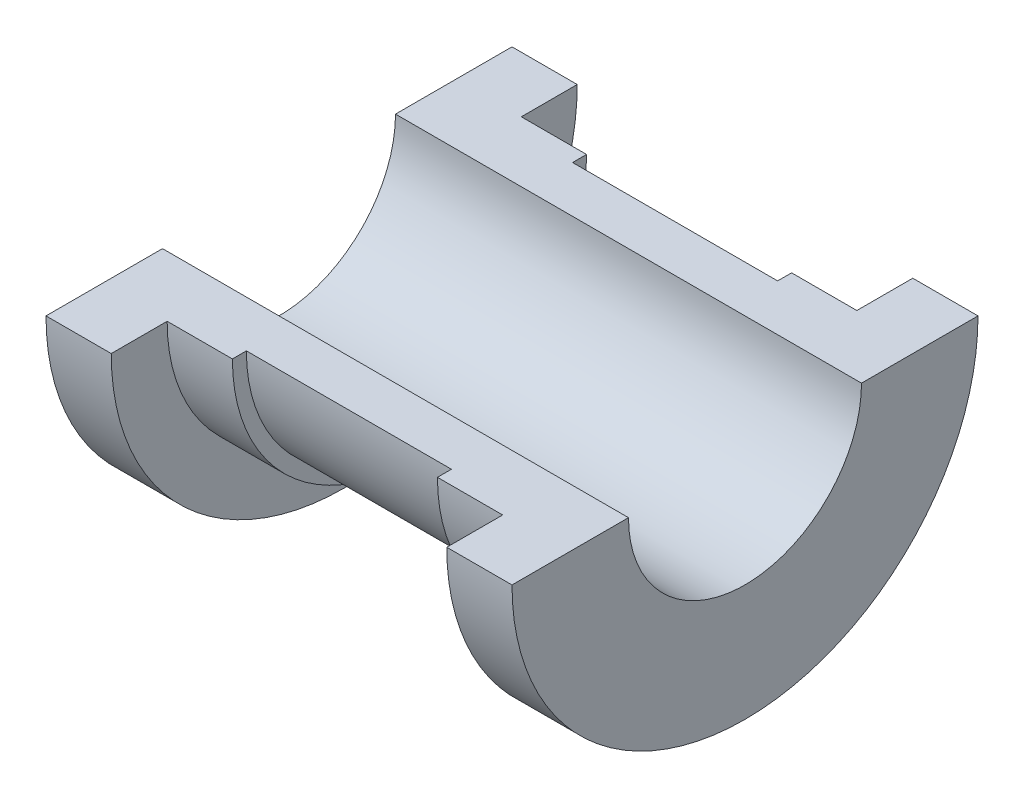
ISO-10303-21;
HEADER;
FILE_DESCRIPTION(('STEP AP214'),'2;1');
FILE_NAME('part.step','',(''),(''),'','','');
FILE_SCHEMA(('AUTOMOTIVE_DESIGN { 1 0 10303 214 1 1 1 1 }'));
ENDSEC;
DATA;
#1=APPLICATION_CONTEXT('core data for automotive mechanical design processes');
#2=APPLICATION_PROTOCOL_DEFINITION('international standard','automotive_design',2000,#1);
#3=PRODUCT_CONTEXT('',#1,'mechanical');
#4=PRODUCT('Part','Part','',(#3));
#5=PRODUCT_RELATED_PRODUCT_CATEGORY('part','',(#4));
#6=PRODUCT_DEFINITION_FORMATION('','',#4);
#7=PRODUCT_DEFINITION_CONTEXT('part definition',#1,'design');
#8=PRODUCT_DEFINITION('design','',#6,#7);
#9=PRODUCT_DEFINITION_SHAPE('','',#8);
#10=(LENGTH_UNIT() NAMED_UNIT(*) SI_UNIT(.MILLI.,.METRE.));
#11=(NAMED_UNIT(*) PLANE_ANGLE_UNIT() SI_UNIT($,.RADIAN.));
#12=(NAMED_UNIT(*) SI_UNIT($,.STERADIAN.) SOLID_ANGLE_UNIT());
#13=UNCERTAINTY_MEASURE_WITH_UNIT(LENGTH_MEASURE(1.E-05),#10,'distance_accuracy_value','');
#14=(GEOMETRIC_REPRESENTATION_CONTEXT(3) GLOBAL_UNCERTAINTY_ASSIGNED_CONTEXT((#13)) GLOBAL_UNIT_ASSIGNED_CONTEXT((#10,
#11,#12)) REPRESENTATION_CONTEXT('',''));
#15=CARTESIAN_POINT('',(0.,0.,0.));
#16=DIRECTION('',(0.,0.,1.));
#17=DIRECTION('',(1.,0.,0.));
#18=AXIS2_PLACEMENT_3D('',#15,#16,#17);
#19=CARTESIAN_POINT('',(-25.,0.,0.));
#20=DIRECTION('',(-1.,0.,0.));
#21=DIRECTION('',(0.,0.,1.));
#22=AXIS2_PLACEMENT_3D('',#19,#20,#21);
#23=CYLINDRICAL_SURFACE('',#22,17.5);
#24=DIRECTION('',(-1.,0.,0.));
#25=VECTOR('',#24,1.);
#26=CARTESIAN_POINT('',(-25.,0.,-17.5));
#27=LINE('',#26,#25);
#28=CARTESIAN_POINT('',(11.,0.,-17.5));
#29=VERTEX_POINT('',#28);
#30=CARTESIAN_POINT('',(-11.,0.,-17.5));
#31=VERTEX_POINT('',#30);
#32=EDGE_CURVE('E231',#29,#31,#27,.T.);
#33=ORIENTED_EDGE('',*,*,#32,.F.);
#34=CARTESIAN_POINT('',(11.,0.,0.));
#35=DIRECTION('',(-1.,0.,0.));
#36=DIRECTION('',(0.,0.,1.));
#37=AXIS2_PLACEMENT_3D('',#34,#35,#36);
#38=CIRCLE('',#37,17.5);
#39=CARTESIAN_POINT('',(11.,0.,17.5));
#40=VERTEX_POINT('',#39);
#41=EDGE_CURVE('E178',#29,#40,#38,.T.);
#42=ORIENTED_EDGE('',*,*,#41,.T.);
#43=DIRECTION('',(-1.,0.,0.));
#44=VECTOR('',#43,1.);
#45=CARTESIAN_POINT('',(-25.,0.,17.5));
#46=LINE('',#45,#44);
#47=CARTESIAN_POINT('',(-11.,0.,17.5));
#48=VERTEX_POINT('',#47);
#49=EDGE_CURVE('E209',#48,#40,#46,.F.);
#50=ORIENTED_EDGE('',*,*,#49,.F.);
#51=CARTESIAN_POINT('',(-11.,0.,0.));
#52=DIRECTION('',(-1.,0.,0.));
#53=DIRECTION('',(0.,0.,1.));
#54=AXIS2_PLACEMENT_3D('',#51,#52,#53);
#55=CIRCLE('',#54,17.5);
#56=EDGE_CURVE('E182',#31,#48,#55,.T.);
#57=ORIENTED_EDGE('',*,*,#56,.F.);
#58=EDGE_LOOP('',(#33,#42,#50,#57));
#59=FACE_BOUND('',#58,.T.);
#60=CARTESIAN_POINT('',(0.,-17.2409396495667,-3.));
#61=CARTESIAN_POINT('',(0.167177539672033,-17.2409427238107,-2.99999334322019));
#62=CARTESIAN_POINT('',(0.334444610125394,-17.2433975799678,-2.9859784908008));
#63=CARTESIAN_POINT('',(0.664280447231107,-17.2529421043199,-2.93031666162569));
#64=CARTESIAN_POINT('',(0.826844817679551,-17.2600359717149,-2.88864464929492));
#65=CARTESIAN_POINT('',(1.14245429646313,-17.2780319968807,-2.77897046037278));
#66=CARTESIAN_POINT('',(1.29550742912675,-17.2889308916418,-2.71099083852852));
#67=CARTESIAN_POINT('',(1.58802070935212,-17.313305084328,-2.55068812102202));
#68=CARTESIAN_POINT('',(1.72748228127175,-17.3267801118422,-2.45836757998599));
#69=CARTESIAN_POINT('',(1.99032230449614,-17.3549451758276,-2.25097753821767));
#70=CARTESIAN_POINT('',(2.11353855159674,-17.3696453757954,-2.13570381628918));
#71=CARTESIAN_POINT('',(2.33898043820508,-17.3985142730382,-1.8861209742386));
#72=CARTESIAN_POINT('',(2.44120480521907,-17.4126829380499,-1.75181070098527));
#73=CARTESIAN_POINT('',(2.62237281253491,-17.4390002009036,-1.46691308220606));
#74=CARTESIAN_POINT('',(2.70116504795438,-17.4511354492007,-1.31622811896212));
#75=CARTESIAN_POINT('',(2.83225850244604,-17.4719053147098,-1.00351837852194));
#76=CARTESIAN_POINT('',(2.88456154295918,-17.4805401726063,-0.841494381888663));
#77=CARTESIAN_POINT('',(2.9606945792627,-17.4932645851018,-0.51238286841017));
#78=CARTESIAN_POINT('',(2.98479732872912,-17.4973976536599,-0.345360157307003));
#79=CARTESIAN_POINT('',(3.00469411724344,-17.5008024112351,-0.00959366953916439));
#80=CARTESIAN_POINT('',(3.0004901869268,-17.500074448968,0.159149982803278));
#81=CARTESIAN_POINT('',(2.96410488928973,-17.4938735157789,0.49170222359127));
#82=CARTESIAN_POINT('',(2.93221709006925,-17.4884503360207,0.655543993481229));
#83=CARTESIAN_POINT('',(2.84183194212004,-17.4735238964266,0.975516328537307));
#84=CARTESIAN_POINT('',(2.78333374661758,-17.4640205067542,1.13164664814084));
#85=CARTESIAN_POINT('',(2.64109924921116,-17.4419170029363,1.43263245757703));
#86=CARTESIAN_POINT('',(2.55724277407832,-17.4293021974191,1.57743003521028));
#87=CARTESIAN_POINT('',(2.36676024360018,-17.402375995437,1.85100900942164));
#88=CARTESIAN_POINT('',(2.26013224138606,-17.3880644539551,1.9797890350765));
#89=CARTESIAN_POINT('',(2.02550744879178,-17.3591182543925,2.21941290689029));
#90=CARTESIAN_POINT('',(1.89725401375731,-17.344481806616,2.33000539360505));
#91=CARTESIAN_POINT('',(1.6238815720677,-17.3167125731742,2.52814283244136));
#92=CARTESIAN_POINT('',(1.47876239186054,-17.3035798029848,2.61568754736626));
#93=CARTESIAN_POINT('',(1.17547725811367,-17.280303555666,2.76529859974534));
#94=CARTESIAN_POINT('',(1.01729539918555,-17.2701637936693,2.82733330960205));
#95=CARTESIAN_POINT('',(0.692543264353517,-17.2540820099746,2.92387975772742));
#96=CARTESIAN_POINT('',(0.525973774257824,-17.2481395958225,2.95839406920572));
#97=CARTESIAN_POINT('',(0.191427521745489,-17.2412016562193,2.99856320128749));
#98=CARTESIAN_POINT('',(0.0234950915230579,-17.2401446099915,3.00457695031049));
#99=CARTESIAN_POINT('',(-0.310976212829604,-17.2429330582015,2.98853197620301));
#100=CARTESIAN_POINT('',(-0.477515143767139,-17.2467783518012,2.96647440309381));
#101=CARTESIAN_POINT('',(-0.803323189710403,-17.258881270067,2.89521941159178));
#102=CARTESIAN_POINT('',(-0.962633731338456,-17.2671089866899,2.84620588243531));
#103=CARTESIAN_POINT('',(-1.27078018367313,-17.2870244527025,2.72262364312904));
#104=CARTESIAN_POINT('',(-1.41961543459914,-17.2987124197933,2.64805332503161));
#105=CARTESIAN_POINT('',(-1.70418032548544,-17.324373772823,2.47463177769395));
#106=CARTESIAN_POINT('',(-1.83976828473403,-17.3383682986708,2.37555125161585));
#107=CARTESIAN_POINT('',(-2.09252245195547,-17.3670046347296,2.15623532353636));
#108=CARTESIAN_POINT('',(-2.20968728480254,-17.381646493154,2.03599834380818));
#109=CARTESIAN_POINT('',(-2.42358659555313,-17.4101230054923,1.77618954233157));
#110=CARTESIAN_POINT('',(-2.52008125794637,-17.4239469640735,1.63641893008565));
#111=CARTESIAN_POINT('',(-2.68821855131539,-17.4490567338254,1.34244211015567));
#112=CARTESIAN_POINT('',(-2.75986202160963,-17.4603426307116,1.18823639022304));
#113=CARTESIAN_POINT('',(-2.87589313081232,-17.4790582835881,0.870468175561603));
#114=CARTESIAN_POINT('',(-2.92040456596352,-17.4865055299022,0.706951958816392));
#115=CARTESIAN_POINT('',(-2.9813060002943,-17.4967788729714,0.374626699017907));
#116=CARTESIAN_POINT('',(-2.99769845343329,-17.4996053729806,0.205818119141562));
#117=CARTESIAN_POINT('',(-3.00182273517432,-17.5003125469087,-0.129988654143555));
#118=CARTESIAN_POINT('',(-2.98991884992763,-17.4982560843078,-0.296982352593287));
#119=CARTESIAN_POINT('',(-2.93857846355612,-17.4895572282875,-0.626554113404314));
#120=CARTESIAN_POINT('',(-2.89914213888004,-17.4829148642581,-0.789132204057234));
#121=CARTESIAN_POINT('',(-2.79399920026691,-17.4657883771442,-1.10510688506267));
#122=CARTESIAN_POINT('',(-2.72832528304086,-17.4553090369673,-1.25851463077402));
#123=CARTESIAN_POINT('',(-2.57261258994026,-17.4316504514312,-1.55218949226269));
#124=CARTESIAN_POINT('',(-2.48257255174676,-17.4184710662012,-1.69245592673013));
#125=CARTESIAN_POINT('',(-2.27940021091573,-17.390671178074,-1.95769741805989));
#126=CARTESIAN_POINT('',(-2.16600189541688,-17.3760351790944,-2.08246711008153));
#127=CARTESIAN_POINT('',(-1.91988909363515,-17.3470767953719,-2.31133475460775));
#128=CARTESIAN_POINT('',(-1.78717008821325,-17.3327544849054,-2.41542785732055));
#129=CARTESIAN_POINT('',(-1.50499349328928,-17.305928230343,-2.60071215805767));
#130=CARTESIAN_POINT('',(-1.35541731797514,-17.2934388002337,-2.68172488708189));
#131=CARTESIAN_POINT('',(-1.04462310549563,-17.2718645235111,-2.81734831227997));
#132=CARTESIAN_POINT('',(-0.883416741217313,-17.2627763183619,-2.87198506892152));
#133=CARTESIAN_POINT('',(-0.601345156446047,-17.2510229398289,-2.94160477458961));
#134=CARTESIAN_POINT('',(-0.482176321494034,-17.2472630378549,-2.96346733737592));
#135=CARTESIAN_POINT('',(-0.242020609403687,-17.2422203045731,-2.99266721494119));
#136=CARTESIAN_POINT('',(-0.121033768571193,-17.2409374238649,-3.00000481939828));
#137=CARTESIAN_POINT('',(0.,-17.2409396495667,-3.));
#138=B_SPLINE_CURVE_WITH_KNOTS('',3,(#60,#61,#62,#63,#64,#65,#66,#67,#68,#69,#70,#71,#72,#73,
#74,#75,#76,#77,#78,#79,#80,#81,#82,#83,#84,#85,#86,#87,#88,#89,#90,#91,#92,#93,#94,#95,#96,#97,
#98,#99,#100,#101,#102,#103,#104,#105,#106,#107,#108,#109,#110,#111,#112,#113,#114,#115,#116,
#117,#118,#119,#120,#121,#122,#123,#124,#125,#126,#127,#128,#129,#130,#131,#132,#133,#134,#135,
#136,#137),.UNSPECIFIED.,.T.,.F.,(4,2,2,2,2,2,2,2,2,2,2,2,2,2,2,2,2,2,2,2,2,2,2,2,2,2,2,2,2,2,2,
2,2,2,2,2,2,2,4),(0.,0.501089951588282,1.00263411527872,1.50374923087268,2.00481177439394,
2.51054946507383,3.01631780370884,3.52528645944317,4.03422011289577,4.53818955823091,
5.04212285070944,5.54077666683348,6.03944635181165,6.54051729263446,7.0416310900563,
7.54917511935568,8.05672437185112,8.56490100620876,9.07303011950976,9.57474267565901,
10.076434678393,10.5747459232883,11.0730885260168,11.576282258526,12.0795135322501,
12.588300132801,13.0970695480365,13.6034998598,14.1098859728562,14.6097882655281,
15.1096873544766,15.6089654137018,16.1082693436371,16.6136095803368,17.1190682073767,
17.6283353233665,18.1370982288975,18.4998862860552,18.8626671078861),.UNSPECIFIED.);
#139=CARTESIAN_POINT('',(0.,-17.2409396495667,-3.));
#140=VERTEX_POINT('',#139);
#141=EDGE_CURVE('E11',#140,#140,#138,.T.);
#142=ORIENTED_EDGE('',*,*,#141,.F.);
#143=EDGE_LOOP('',(#142));
#144=FACE_BOUND('',#143,.T.);
#145=ADVANCED_FACE('F43',(#59,#144),#23,.T.);
#146=CARTESIAN_POINT('',(25.,0.,0.));
#147=DIRECTION('',(-1.,0.,0.));
#148=DIRECTION('',(0.,0.,1.));
#149=AXIS2_PLACEMENT_3D('',#146,#147,#148);
#150=PLANE('',#149);
#151=DIRECTION('',(0.,0.,-1.));
#152=VECTOR('',#151,1.);
#153=CARTESIAN_POINT('',(25.,0.,0.));
#154=LINE('',#153,#152);
#155=CARTESIAN_POINT('',(25.,0.,25.));
#156=VERTEX_POINT('',#155);
#157=CARTESIAN_POINT('',(25.,0.,12.5));
#158=VERTEX_POINT('',#157);
#159=EDGE_CURVE('E71',#156,#158,#154,.T.);
#160=ORIENTED_EDGE('',*,*,#159,.F.);
#161=CARTESIAN_POINT('',(25.,0.,0.));
#162=DIRECTION('',(-1.,0.,0.));
#163=DIRECTION('',(0.,0.,1.));
#164=AXIS2_PLACEMENT_3D('',#161,#162,#163);
#165=CIRCLE('',#164,25.);
#166=CARTESIAN_POINT('',(25.,0.,-25.));
#167=VERTEX_POINT('',#166);
#168=EDGE_CURVE('E151',#167,#156,#165,.T.);
#169=ORIENTED_EDGE('',*,*,#168,.F.);
#170=CARTESIAN_POINT('',(25.,0.,-12.5));
#171=VERTEX_POINT('',#170);
#172=EDGE_CURVE('E150',#171,#167,#154,.T.);
#173=ORIENTED_EDGE('',*,*,#172,.F.);
#174=CARTESIAN_POINT('',(25.,0.,0.));
#175=DIRECTION('',(1.,0.,0.));
#176=DIRECTION('',(0.,0.,-1.));
#177=AXIS2_PLACEMENT_3D('',#174,#175,#176);
#178=CIRCLE('',#177,12.5);
#179=EDGE_CURVE('E138',#158,#171,#178,.T.);
#180=ORIENTED_EDGE('',*,*,#179,.F.);
#181=EDGE_LOOP('',(#160,#169,#173,#180));
#182=FACE_BOUND('',#181,.T.);
#183=ADVANCED_FACE('F45',(#182),#150,.F.);
#184=CARTESIAN_POINT('',(18.,25.,0.));
#185=DIRECTION('',(1.,0.,0.));
#186=DIRECTION('',(0.,0.,-1.));
#187=AXIS2_PLACEMENT_3D('',#184,#185,#186);
#188=PLANE('',#187);
#189=DIRECTION('',(0.,0.,1.));
#190=VECTOR('',#189,1.);
#191=CARTESIAN_POINT('',(18.,0.,0.));
#192=LINE('',#191,#190);
#193=CARTESIAN_POINT('',(18.,0.,-25.));
#194=VERTEX_POINT('',#193);
#195=CARTESIAN_POINT('',(18.,0.,-19.));
#196=VERTEX_POINT('',#195);
#197=EDGE_CURVE('E219',#194,#196,#192,.T.);
#198=ORIENTED_EDGE('',*,*,#197,.F.);
#199=CARTESIAN_POINT('',(18.,0.,0.));
#200=DIRECTION('',(-1.,0.,0.));
#201=DIRECTION('',(0.,0.,1.));
#202=AXIS2_PLACEMENT_3D('',#199,#200,#201);
#203=CIRCLE('',#202,25.);
#204=CARTESIAN_POINT('',(18.,0.,25.));
#205=VERTEX_POINT('',#204);
#206=EDGE_CURVE('E164',#194,#205,#203,.T.);
#207=ORIENTED_EDGE('',*,*,#206,.T.);
#208=CARTESIAN_POINT('',(18.,0.,19.));
#209=VERTEX_POINT('',#208);
#210=EDGE_CURVE('E147',#209,#205,#192,.T.);
#211=ORIENTED_EDGE('',*,*,#210,.F.);
#212=CARTESIAN_POINT('',(18.,0.,0.));
#213=DIRECTION('',(-1.,0.,0.));
#214=DIRECTION('',(0.,0.,1.));
#215=AXIS2_PLACEMENT_3D('',#212,#213,#214);
#216=CIRCLE('',#215,19.);
#217=EDGE_CURVE('E170',#196,#209,#216,.T.);
#218=ORIENTED_EDGE('',*,*,#217,.F.);
#219=EDGE_LOOP('',(#198,#207,#211,#218));
#220=FACE_BOUND('',#219,.T.);
#221=ADVANCED_FACE('F276',(#220),#188,.F.);
#222=CARTESIAN_POINT('',(-25.,0.,0.));
#223=DIRECTION('',(-1.,0.,0.));
#224=DIRECTION('',(0.,0.,1.));
#225=AXIS2_PLACEMENT_3D('',#222,#223,#224);
#226=CYLINDRICAL_SURFACE('',#225,19.);
#227=DIRECTION('',(-1.,0.,0.));
#228=VECTOR('',#227,1.);
#229=CARTESIAN_POINT('',(-25.,0.,-19.));
#230=LINE('',#229,#228);
#231=CARTESIAN_POINT('',(11.,0.,-19.));
#232=VERTEX_POINT('',#231);
#233=EDGE_CURVE('E223',#196,#232,#230,.T.);
#234=ORIENTED_EDGE('',*,*,#233,.F.);
#235=ORIENTED_EDGE('',*,*,#217,.T.);
#236=DIRECTION('',(-1.,0.,0.));
#237=VECTOR('',#236,1.);
#238=CARTESIAN_POINT('',(-25.,0.,19.));
#239=LINE('',#238,#237);
#240=CARTESIAN_POINT('',(11.,0.,19.));
#241=VERTEX_POINT('',#240);
#242=EDGE_CURVE('E204',#241,#209,#239,.F.);
#243=ORIENTED_EDGE('',*,*,#242,.F.);
#244=CARTESIAN_POINT('',(11.,0.,0.));
#245=DIRECTION('',(-1.,0.,0.));
#246=DIRECTION('',(0.,0.,1.));
#247=AXIS2_PLACEMENT_3D('',#244,#245,#246);
#248=CIRCLE('',#247,19.);
#249=EDGE_CURVE('E174',#232,#241,#248,.T.);
#250=ORIENTED_EDGE('',*,*,#249,.F.);
#251=EDGE_LOOP('',(#234,#235,#243,#250));
#252=FACE_BOUND('',#251,.T.);
#253=ADVANCED_FACE('F286',(#252),#226,.T.);
#254=CARTESIAN_POINT('',(11.,19.,0.));
#255=DIRECTION('',(1.,0.,0.));
#256=DIRECTION('',(0.,0.,-1.));
#257=AXIS2_PLACEMENT_3D('',#254,#255,#256);
#258=PLANE('',#257);
#259=DIRECTION('',(0.,0.,1.));
#260=VECTOR('',#259,1.);
#261=CARTESIAN_POINT('',(11.,0.,0.));
#262=LINE('',#261,#260);
#263=EDGE_CURVE('E227',#232,#29,#262,.T.);
#264=ORIENTED_EDGE('',*,*,#263,.F.);
#265=ORIENTED_EDGE('',*,*,#249,.T.);
#266=EDGE_CURVE('E208',#40,#241,#262,.T.);
#267=ORIENTED_EDGE('',*,*,#266,.F.);
#268=ORIENTED_EDGE('',*,*,#41,.F.);
#269=EDGE_LOOP('',(#264,#265,#267,#268));
#270=FACE_BOUND('',#269,.T.);
#271=ADVANCED_FACE('F283',(#270),#258,.F.);
#272=CARTESIAN_POINT('',(-11.,19.,0.));
#273=DIRECTION('',(-1.,0.,0.));
#274=DIRECTION('',(0.,0.,1.));
#275=AXIS2_PLACEMENT_3D('',#272,#273,#274);
#276=PLANE('',#275);
#277=DIRECTION('',(0.,0.,-1.));
#278=VECTOR('',#277,1.);
#279=CARTESIAN_POINT('',(-11.,0.,0.));
#280=LINE('',#279,#278);
#281=CARTESIAN_POINT('',(-11.,0.,19.));
#282=VERTEX_POINT('',#281);
#283=EDGE_CURVE('E213',#282,#48,#280,.T.);
#284=ORIENTED_EDGE('',*,*,#283,.F.);
#285=CARTESIAN_POINT('',(-11.,0.,0.));
#286=DIRECTION('',(-1.,0.,0.));
#287=DIRECTION('',(0.,0.,1.));
#288=AXIS2_PLACEMENT_3D('',#285,#286,#287);
#289=CIRCLE('',#288,19.);
#290=CARTESIAN_POINT('',(-11.,0.,-19.));
#291=VERTEX_POINT('',#290);
#292=EDGE_CURVE('E186',#291,#282,#289,.T.);
#293=ORIENTED_EDGE('',*,*,#292,.F.);
#294=EDGE_CURVE('E235',#31,#291,#280,.T.);
#295=ORIENTED_EDGE('',*,*,#294,.F.);
#296=ORIENTED_EDGE('',*,*,#56,.T.);
#297=EDGE_LOOP('',(#284,#293,#295,#296));
#298=FACE_BOUND('',#297,.T.);
#299=ADVANCED_FACE('F281',(#298),#276,.F.);
#300=CARTESIAN_POINT('',(-25.,0.,0.));
#301=DIRECTION('',(-1.,0.,0.));
#302=DIRECTION('',(0.,0.,1.));
#303=AXIS2_PLACEMENT_3D('',#300,#301,#302);
#304=CYLINDRICAL_SURFACE('',#303,19.);
#305=DIRECTION('',(-1.,0.,0.));
#306=VECTOR('',#305,1.);
#307=CARTESIAN_POINT('',(-25.,0.,-19.));
#308=LINE('',#307,#306);
#309=CARTESIAN_POINT('',(-18.,0.,-19.));
#310=VERTEX_POINT('',#309);
#311=EDGE_CURVE('E239',#291,#310,#308,.T.);
#312=ORIENTED_EDGE('',*,*,#311,.F.);
#313=ORIENTED_EDGE('',*,*,#292,.T.);
#314=DIRECTION('',(-1.,0.,0.));
#315=VECTOR('',#314,1.);
#316=CARTESIAN_POINT('',(-25.,0.,19.));
#317=LINE('',#316,#315);
#318=CARTESIAN_POINT('',(-18.,0.,19.));
#319=VERTEX_POINT('',#318);
#320=EDGE_CURVE('E214',#319,#282,#317,.F.);
#321=ORIENTED_EDGE('',*,*,#320,.F.);
#322=CARTESIAN_POINT('',(-18.,0.,0.));
#323=DIRECTION('',(-1.,0.,0.));
#324=DIRECTION('',(0.,0.,1.));
#325=AXIS2_PLACEMENT_3D('',#322,#323,#324);
#326=CIRCLE('',#325,19.);
#327=EDGE_CURVE('E190',#310,#319,#326,.T.);
#328=ORIENTED_EDGE('',*,*,#327,.F.);
#329=EDGE_LOOP('',(#312,#313,#321,#328));
#330=FACE_BOUND('',#329,.T.);
#331=ADVANCED_FACE('F326',(#330),#304,.T.);
#332=CARTESIAN_POINT('',(-18.,25.,0.));
#333=DIRECTION('',(-1.,0.,0.));
#334=DIRECTION('',(0.,0.,1.));
#335=AXIS2_PLACEMENT_3D('',#332,#333,#334);
#336=PLANE('',#335);
#337=DIRECTION('',(0.,0.,-1.));
#338=VECTOR('',#337,1.);
#339=CARTESIAN_POINT('',(-18.,0.,0.));
#340=LINE('',#339,#338);
#341=CARTESIAN_POINT('',(-18.,0.,25.));
#342=VERTEX_POINT('',#341);
#343=EDGE_CURVE('E218',#342,#319,#340,.T.);
#344=ORIENTED_EDGE('',*,*,#343,.F.);
#345=CARTESIAN_POINT('',(-18.,0.,0.));
#346=DIRECTION('',(-1.,0.,0.));
#347=DIRECTION('',(0.,0.,1.));
#348=AXIS2_PLACEMENT_3D('',#345,#346,#347);
#349=CIRCLE('',#348,25.);
#350=CARTESIAN_POINT('',(-18.,0.,-25.));
#351=VERTEX_POINT('',#350);
#352=EDGE_CURVE('E194',#351,#342,#349,.T.);
#353=ORIENTED_EDGE('',*,*,#352,.F.);
#354=EDGE_CURVE('E243',#310,#351,#340,.T.);
#355=ORIENTED_EDGE('',*,*,#354,.F.);
#356=ORIENTED_EDGE('',*,*,#327,.T.);
#357=EDGE_LOOP('',(#344,#353,#355,#356));
#358=FACE_BOUND('',#357,.T.);
#359=ADVANCED_FACE('F331',(#358),#336,.F.);
#360=CARTESIAN_POINT('',(-25.,0.,0.));
#361=DIRECTION('',(1.,0.,0.));
#362=DIRECTION('',(0.,0.,-1.));
#363=AXIS2_PLACEMENT_3D('',#360,#361,#362);
#364=PLANE('',#363);
#365=DIRECTION('',(0.,0.,1.));
#366=VECTOR('',#365,1.);
#367=CARTESIAN_POINT('',(-25.,0.,0.));
#368=LINE('',#367,#366);
#369=CARTESIAN_POINT('',(-25.,0.,-25.));
#370=VERTEX_POINT('',#369);
#371=CARTESIAN_POINT('',(-25.,0.,-12.5));
#372=VERTEX_POINT('',#371);
#373=EDGE_CURVE('E155',#370,#372,#368,.T.);
#374=ORIENTED_EDGE('',*,*,#373,.F.);
#375=CARTESIAN_POINT('',(-25.,0.,0.));
#376=DIRECTION('',(-1.,0.,0.));
#377=DIRECTION('',(0.,0.,1.));
#378=AXIS2_PLACEMENT_3D('',#375,#376,#377);
#379=CIRCLE('',#378,25.);
#380=CARTESIAN_POINT('',(-25.,0.,25.));
#381=VERTEX_POINT('',#380);
#382=EDGE_CURVE('E198',#370,#381,#379,.T.);
#383=ORIENTED_EDGE('',*,*,#382,.T.);
#384=CARTESIAN_POINT('',(-25.,0.,12.5));
#385=VERTEX_POINT('',#384);
#386=EDGE_CURVE('E154',#385,#381,#368,.T.);
#387=ORIENTED_EDGE('',*,*,#386,.F.);
#388=CARTESIAN_POINT('',(-25.,0.,0.));
#389=DIRECTION('',(1.,0.,0.));
#390=DIRECTION('',(0.,0.,-1.));
#391=AXIS2_PLACEMENT_3D('',#388,#389,#390);
#392=CIRCLE('',#391,12.5);
#393=EDGE_CURVE('E146',#385,#372,#392,.T.);
#394=ORIENTED_EDGE('',*,*,#393,.T.);
#395=EDGE_LOOP('',(#374,#383,#387,#394));
#396=FACE_BOUND('',#395,.T.);
#397=ADVANCED_FACE('F302',(#396),#364,.F.);
#398=CARTESIAN_POINT('',(-25.,0.,0.));
#399=DIRECTION('',(1.,0.,0.));
#400=DIRECTION('',(0.,0.,-1.));
#401=AXIS2_PLACEMENT_3D('',#398,#399,#400);
#402=CYLINDRICAL_SURFACE('',#401,12.5);
#403=DIRECTION('',(1.,0.,0.));
#404=VECTOR('',#403,1.);
#405=CARTESIAN_POINT('',(-25.,0.,12.5));
#406=LINE('',#405,#404);
#407=EDGE_CURVE('E57',#158,#385,#406,.F.);
#408=ORIENTED_EDGE('',*,*,#407,.F.);
#409=ORIENTED_EDGE('',*,*,#179,.T.);
#410=DIRECTION('',(1.,0.,0.));
#411=VECTOR('',#410,1.);
#412=CARTESIAN_POINT('',(-25.,0.,-12.5));
#413=LINE('',#412,#411);
#414=EDGE_CURVE('E142',#372,#171,#413,.T.);
#415=ORIENTED_EDGE('',*,*,#414,.F.);
#416=ORIENTED_EDGE('',*,*,#393,.F.);
#417=EDGE_LOOP('',(#408,#409,#415,#416));
#418=FACE_BOUND('',#417,.T.);
#419=ADVANCED_FACE('F140',(#418),#402,.F.);
#420=CARTESIAN_POINT('',(-25.,0.,0.));
#421=DIRECTION('',(-1.,0.,0.));
#422=DIRECTION('',(0.,0.,1.));
#423=AXIS2_PLACEMENT_3D('',#420,#421,#422);
#424=CYLINDRICAL_SURFACE('',#423,25.);
#425=ORIENTED_EDGE('',*,*,#168,.T.);
#426=DIRECTION('',(-1.,0.,0.));
#427=VECTOR('',#426,1.);
#428=CARTESIAN_POINT('',(133.253175473055,0.,25.));
#429=LINE('',#428,#427);
#430=EDGE_CURVE('E252',#156,#205,#429,.T.);
#431=ORIENTED_EDGE('',*,*,#430,.T.);
#432=ORIENTED_EDGE('',*,*,#206,.F.);
#433=DIRECTION('',(-1.,0.,0.));
#434=VECTOR('',#433,1.);
#435=CARTESIAN_POINT('',(133.253175473055,0.,-25.));
#436=LINE('',#435,#434);
#437=EDGE_CURVE('E64',#167,#194,#436,.T.);
#438=ORIENTED_EDGE('',*,*,#437,.F.);
#439=EDGE_LOOP('',(#425,#431,#432,#438));
#440=FACE_BOUND('',#439,.T.);
#441=ADVANCED_FACE('F293',(#440),#424,.T.);
#442=CARTESIAN_POINT('',(-25.,0.,0.));
#443=DIRECTION('',(-1.,0.,0.));
#444=DIRECTION('',(0.,0.,1.));
#445=AXIS2_PLACEMENT_3D('',#442,#443,#444);
#446=CYLINDRICAL_SURFACE('',#445,25.);
#447=ORIENTED_EDGE('',*,*,#352,.T.);
#448=EDGE_CURVE('E249',#342,#381,#429,.T.);
#449=ORIENTED_EDGE('',*,*,#448,.T.);
#450=ORIENTED_EDGE('',*,*,#382,.F.);
#451=EDGE_CURVE('E254',#351,#370,#436,.T.);
#452=ORIENTED_EDGE('',*,*,#451,.F.);
#453=EDGE_LOOP('',(#447,#449,#450,#452));
#454=FACE_BOUND('',#453,.T.);
#455=ADVANCED_FACE('F295',(#454),#446,.T.);
#456=CARTESIAN_POINT('',(133.253175473055,0.,25.));
#457=DIRECTION('',(0.,1.,0.));
#458=DIRECTION('',(0.,0.,1.));
#459=AXIS2_PLACEMENT_3D('',#456,#457,#458);
#460=PLANE('',#459);
#461=ORIENTED_EDGE('',*,*,#437,.T.);
#462=ORIENTED_EDGE('',*,*,#197,.T.);
#463=ORIENTED_EDGE('',*,*,#233,.T.);
#464=ORIENTED_EDGE('',*,*,#263,.T.);
#465=ORIENTED_EDGE('',*,*,#32,.T.);
#466=ORIENTED_EDGE('',*,*,#294,.T.);
#467=ORIENTED_EDGE('',*,*,#311,.T.);
#468=ORIENTED_EDGE('',*,*,#354,.T.);
#469=ORIENTED_EDGE('',*,*,#451,.T.);
#470=ORIENTED_EDGE('',*,*,#373,.T.);
#471=ORIENTED_EDGE('',*,*,#414,.T.);
#472=ORIENTED_EDGE('',*,*,#172,.T.);
#473=EDGE_LOOP('',(#461,#462,#463,#464,#465,#466,#467,#468,#469,#470,#471,#472));
#474=FACE_BOUND('',#473,.T.);
#475=ADVANCED_FACE('F158',(#474),#460,.T.);
#476=ORIENTED_EDGE('',*,*,#242,.T.);
#477=ORIENTED_EDGE('',*,*,#210,.T.);
#478=ORIENTED_EDGE('',*,*,#430,.F.);
#479=ORIENTED_EDGE('',*,*,#159,.T.);
#480=ORIENTED_EDGE('',*,*,#407,.T.);
#481=ORIENTED_EDGE('',*,*,#386,.T.);
#482=ORIENTED_EDGE('',*,*,#448,.F.);
#483=ORIENTED_EDGE('',*,*,#343,.T.);
#484=ORIENTED_EDGE('',*,*,#320,.T.);
#485=ORIENTED_EDGE('',*,*,#283,.T.);
#486=ORIENTED_EDGE('',*,*,#49,.T.);
#487=ORIENTED_EDGE('',*,*,#266,.T.);
#488=EDGE_LOOP('',(#476,#477,#478,#479,#480,#481,#482,#483,#484,#485,#486,#487));
#489=FACE_BOUND('',#488,.T.);
#490=ADVANCED_FACE('F270',(#489),#460,.T.);
#491=CARTESIAN_POINT('',(0.,-15.,0.));
#492=DIRECTION('',(0.,-1.,0.));
#493=DIRECTION('',(0.,0.,-1.));
#494=AXIS2_PLACEMENT_3D('',#491,#492,#493);
#495=CYLINDRICAL_SURFACE('',#494,3.);
#496=CARTESIAN_POINT('',(0.,-20.,0.));
#497=DIRECTION('',(0.,1.,0.));
#498=DIRECTION('',(0.,0.,1.));
#499=AXIS2_PLACEMENT_3D('',#496,#497,#498);
#500=CIRCLE('',#499,3.);
#501=CARTESIAN_POINT('',(0.,-20.,3.));
#502=VERTEX_POINT('',#501);
#503=EDGE_CURVE('E253',#502,#502,#500,.T.);
#504=ORIENTED_EDGE('',*,*,#503,.T.);
#505=EDGE_LOOP('',(#504));
#506=FACE_BOUND('',#505,.T.);
#507=ORIENTED_EDGE('',*,*,#141,.T.);
#508=EDGE_LOOP('',(#507));
#509=FACE_BOUND('',#508,.T.);
#510=ADVANCED_FACE('F261',(#506,#509),#495,.T.);
#511=CARTESIAN_POINT('',(0.,-20.,0.));
#512=DIRECTION('',(0.,1.,0.));
#513=DIRECTION('',(0.,0.,1.));
#514=AXIS2_PLACEMENT_3D('',#511,#512,#513);
#515=PLANE('',#514);
#516=ORIENTED_EDGE('',*,*,#503,.F.);
#517=EDGE_LOOP('',(#516));
#518=FACE_BOUND('',#517,.T.);
#519=ADVANCED_FACE('F264',(#518),#515,.F.);
#520=CLOSED_SHELL('',(#145,#183,#221,#253,#271,#299,#331,#359,#397,#419,#441,#455,#475,#490,
#510,#519));
#521=MANIFOLD_SOLID_BREP('B2',#520);
#522=ADVANCED_BREP_SHAPE_REPRESENTATION('',(#18,#521),#14);
#523=SHAPE_DEFINITION_REPRESENTATION(#9,#522);
ENDSEC;
END-ISO-10303-21;
